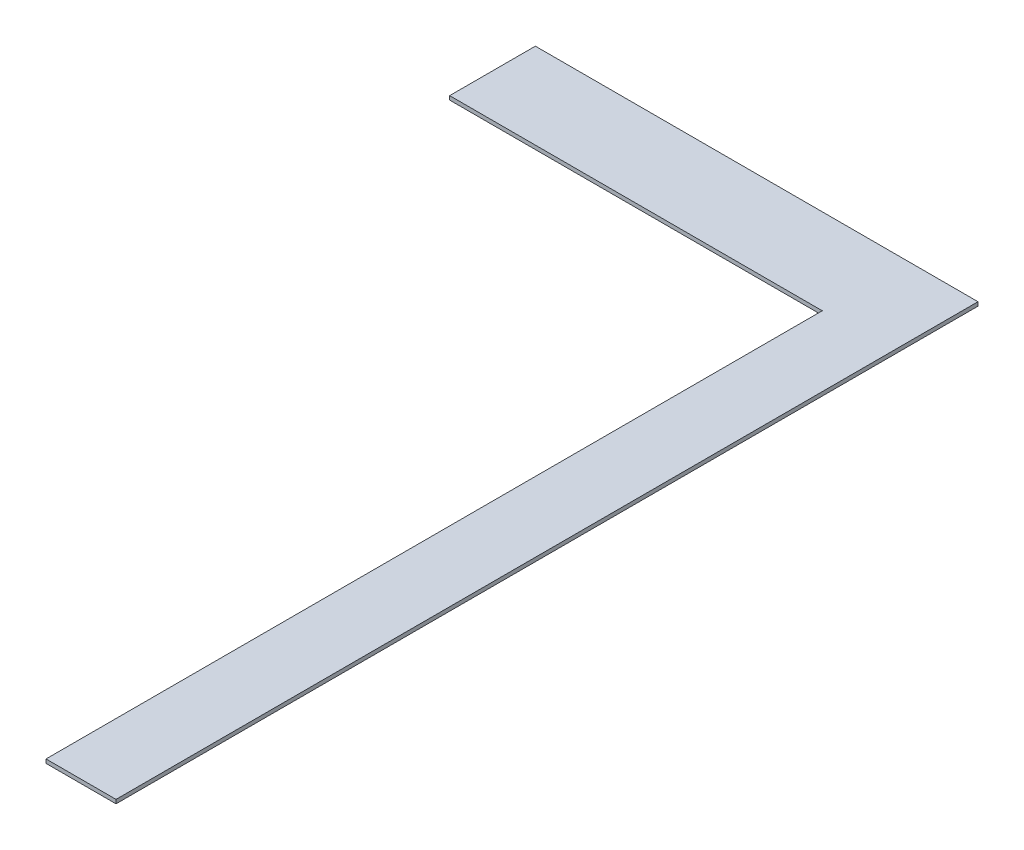
ISO-10303-21;
HEADER;
FILE_DESCRIPTION(('STEP AP214'),'2;1');
FILE_NAME('part.step','',(''),(''),'','','');
FILE_SCHEMA(('AUTOMOTIVE_DESIGN { 1 0 10303 214 1 1 1 1 }'));
ENDSEC;
DATA;
#1=APPLICATION_CONTEXT('core data for automotive mechanical design processes');
#2=APPLICATION_PROTOCOL_DEFINITION('international standard','automotive_design',2000,#1);
#3=PRODUCT_CONTEXT('',#1,'mechanical');
#4=PRODUCT('Part','Part','',(#3));
#5=PRODUCT_RELATED_PRODUCT_CATEGORY('part','',(#4));
#6=PRODUCT_DEFINITION_FORMATION('','',#4);
#7=PRODUCT_DEFINITION_CONTEXT('part definition',#1,'design');
#8=PRODUCT_DEFINITION('design','',#6,#7);
#9=PRODUCT_DEFINITION_SHAPE('','',#8);
#10=(LENGTH_UNIT() NAMED_UNIT(*) SI_UNIT(.MILLI.,.METRE.));
#11=(NAMED_UNIT(*) PLANE_ANGLE_UNIT() SI_UNIT($,.RADIAN.));
#12=(NAMED_UNIT(*) SI_UNIT($,.STERADIAN.) SOLID_ANGLE_UNIT());
#13=UNCERTAINTY_MEASURE_WITH_UNIT(LENGTH_MEASURE(1.E-05),#10,'distance_accuracy_value','');
#14=(GEOMETRIC_REPRESENTATION_CONTEXT(3) GLOBAL_UNCERTAINTY_ASSIGNED_CONTEXT((#13)) GLOBAL_UNIT_ASSIGNED_CONTEXT((#10,
#11,#12)) REPRESENTATION_CONTEXT('',''));
#15=CARTESIAN_POINT('',(0.,0.,0.));
#16=DIRECTION('',(0.,0.,1.));
#17=DIRECTION('',(1.,0.,0.));
#18=AXIS2_PLACEMENT_3D('',#15,#16,#17);
#19=CARTESIAN_POINT('',(-1425.5,-12.5,276.));
#20=DIRECTION('',(0.,0.,1.));
#21=DIRECTION('',(1.,0.,0.));
#22=AXIS2_PLACEMENT_3D('',#19,#20,#21);
#23=PLANE('',#22);
#24=DIRECTION('',(1.,0.,0.));
#25=VECTOR('',#24,1.);
#26=CARTESIAN_POINT('',(-1425.5,0.,276.));
#27=LINE('',#26,#25);
#28=CARTESIAN_POINT('',(-1425.5,0.,276.));
#29=VERTEX_POINT('',#28);
#30=CARTESIAN_POINT('',(-225.5,0.,276.));
#31=VERTEX_POINT('',#30);
#32=EDGE_CURVE('E119',#29,#31,#27,.T.);
#33=ORIENTED_EDGE('',*,*,#32,.F.);
#34=DIRECTION('',(0.,1.,0.));
#35=VECTOR('',#34,1.);
#36=CARTESIAN_POINT('',(-1425.5,-12.5,276.));
#37=LINE('',#36,#35);
#38=CARTESIAN_POINT('',(-1425.5,-12.5,276.));
#39=VERTEX_POINT('',#38);
#40=EDGE_CURVE('E11',#39,#29,#37,.T.);
#41=ORIENTED_EDGE('',*,*,#40,.F.);
#42=DIRECTION('',(1.,0.,0.));
#43=VECTOR('',#42,1.);
#44=CARTESIAN_POINT('',(-1425.5,-12.5,276.));
#45=LINE('',#44,#43);
#46=CARTESIAN_POINT('',(-225.5,-12.5,276.));
#47=VERTEX_POINT('',#46);
#48=EDGE_CURVE('E133',#39,#47,#45,.T.);
#49=ORIENTED_EDGE('',*,*,#48,.T.);
#50=DIRECTION('',(0.,1.,0.));
#51=VECTOR('',#50,1.);
#52=CARTESIAN_POINT('',(-225.5,-12.5,276.));
#53=LINE('',#52,#51);
#54=EDGE_CURVE('E37',#47,#31,#53,.T.);
#55=ORIENTED_EDGE('',*,*,#54,.T.);
#56=EDGE_LOOP('',(#33,#41,#49,#55));
#57=FACE_BOUND('',#56,.T.);
#58=ADVANCED_FACE('F34',(#57),#23,.T.);
#59=CARTESIAN_POINT('',(-1425.5,-12.5,276.));
#60=DIRECTION('',(-1.,0.,0.));
#61=DIRECTION('',(0.,0.,1.));
#62=AXIS2_PLACEMENT_3D('',#59,#60,#61);
#63=PLANE('',#62);
#64=DIRECTION('',(0.,0.,1.));
#65=VECTOR('',#64,1.);
#66=CARTESIAN_POINT('',(-1425.5,0.,276.));
#67=LINE('',#66,#65);
#68=CARTESIAN_POINT('',(-1425.5,0.,0.));
#69=VERTEX_POINT('',#68);
#70=EDGE_CURVE('E131',#69,#29,#67,.T.);
#71=ORIENTED_EDGE('',*,*,#70,.F.);
#72=DIRECTION('',(0.,1.,0.));
#73=VECTOR('',#72,1.);
#74=CARTESIAN_POINT('',(-1425.5,-12.5,0.));
#75=LINE('',#74,#73);
#76=CARTESIAN_POINT('',(-1425.5,-12.5,0.));
#77=VERTEX_POINT('',#76);
#78=EDGE_CURVE('E43',#77,#69,#75,.T.);
#79=ORIENTED_EDGE('',*,*,#78,.F.);
#80=DIRECTION('',(0.,0.,1.));
#81=VECTOR('',#80,1.);
#82=CARTESIAN_POINT('',(-1425.5,-12.5,276.));
#83=LINE('',#82,#81);
#84=EDGE_CURVE('E109',#77,#39,#83,.T.);
#85=ORIENTED_EDGE('',*,*,#84,.T.);
#86=ORIENTED_EDGE('',*,*,#40,.T.);
#87=EDGE_LOOP('',(#71,#79,#85,#86));
#88=FACE_BOUND('',#87,.T.);
#89=ADVANCED_FACE('F141',(#88),#63,.T.);
#90=CARTESIAN_POINT('',(-1425.5,-12.5,0.));
#91=DIRECTION('',(0.,0.,-1.));
#92=DIRECTION('',(-1.,0.,0.));
#93=AXIS2_PLACEMENT_3D('',#90,#91,#92);
#94=PLANE('',#93);
#95=DIRECTION('',(-1.,0.,0.));
#96=VECTOR('',#95,1.);
#97=CARTESIAN_POINT('',(-1425.5,0.,0.));
#98=LINE('',#97,#96);
#99=CARTESIAN_POINT('',(0.,0.,0.));
#100=VERTEX_POINT('',#99);
#101=EDGE_CURVE('E96',#100,#69,#98,.T.);
#102=ORIENTED_EDGE('',*,*,#101,.F.);
#103=DIRECTION('',(0.,1.,0.));
#104=VECTOR('',#103,1.);
#105=CARTESIAN_POINT('',(0.,-12.5,0.));
#106=LINE('',#105,#104);
#107=CARTESIAN_POINT('',(0.,-12.5,0.));
#108=VERTEX_POINT('',#107);
#109=EDGE_CURVE('E91',#108,#100,#106,.T.);
#110=ORIENTED_EDGE('',*,*,#109,.F.);
#111=DIRECTION('',(-1.,0.,0.));
#112=VECTOR('',#111,1.);
#113=CARTESIAN_POINT('',(-1425.5,-12.5,0.));
#114=LINE('',#113,#112);
#115=EDGE_CURVE('E94',#108,#77,#114,.T.);
#116=ORIENTED_EDGE('',*,*,#115,.T.);
#117=ORIENTED_EDGE('',*,*,#78,.T.);
#118=EDGE_LOOP('',(#102,#110,#116,#117));
#119=FACE_BOUND('',#118,.T.);
#120=ADVANCED_FACE('F93',(#119),#94,.T.);
#121=CARTESIAN_POINT('',(0.,-12.5,0.));
#122=DIRECTION('',(1.,0.,0.));
#123=DIRECTION('',(0.,0.,-1.));
#124=AXIS2_PLACEMENT_3D('',#121,#122,#123);
#125=PLANE('',#124);
#126=DIRECTION('',(0.,0.,-1.));
#127=VECTOR('',#126,1.);
#128=CARTESIAN_POINT('',(0.,0.,0.));
#129=LINE('',#128,#127);
#130=CARTESIAN_POINT('',(3.40005801291454E-13,0.,2776.));
#131=VERTEX_POINT('',#130);
#132=EDGE_CURVE('E128',#131,#100,#129,.T.);
#133=ORIENTED_EDGE('',*,*,#132,.F.);
#134=DIRECTION('',(0.,1.,0.));
#135=VECTOR('',#134,1.);
#136=CARTESIAN_POINT('',(3.40005801291454E-13,-12.5,2776.));
#137=LINE('',#136,#135);
#138=CARTESIAN_POINT('',(3.40005801291454E-13,-12.5,2776.));
#139=VERTEX_POINT('',#138);
#140=EDGE_CURVE('E101',#139,#131,#137,.T.);
#141=ORIENTED_EDGE('',*,*,#140,.F.);
#142=DIRECTION('',(0.,0.,-1.));
#143=VECTOR('',#142,1.);
#144=CARTESIAN_POINT('',(0.,-12.5,0.));
#145=LINE('',#144,#143);
#146=EDGE_CURVE('E107',#139,#108,#145,.T.);
#147=ORIENTED_EDGE('',*,*,#146,.T.);
#148=ORIENTED_EDGE('',*,*,#109,.T.);
#149=EDGE_LOOP('',(#133,#141,#147,#148));
#150=FACE_BOUND('',#149,.T.);
#151=ADVANCED_FACE('F111',(#150),#125,.T.);
#152=CARTESIAN_POINT('',(3.40005801291454E-13,-12.5,2776.));
#153=DIRECTION('',(0.,0.,1.));
#154=DIRECTION('',(1.,0.,0.));
#155=AXIS2_PLACEMENT_3D('',#152,#153,#154);
#156=PLANE('',#155);
#157=DIRECTION('',(1.,0.,0.));
#158=VECTOR('',#157,1.);
#159=CARTESIAN_POINT('',(3.40005801291454E-13,0.,2776.));
#160=LINE('',#159,#158);
#161=CARTESIAN_POINT('',(-225.5,0.,2776.));
#162=VERTEX_POINT('',#161);
#163=EDGE_CURVE('E125',#162,#131,#160,.T.);
#164=ORIENTED_EDGE('',*,*,#163,.F.);
#165=DIRECTION('',(0.,1.,0.));
#166=VECTOR('',#165,1.);
#167=CARTESIAN_POINT('',(-225.5,-12.5,2776.));
#168=LINE('',#167,#166);
#169=CARTESIAN_POINT('',(-225.5,-12.5,2776.));
#170=VERTEX_POINT('',#169);
#171=EDGE_CURVE('E136',#170,#162,#168,.T.);
#172=ORIENTED_EDGE('',*,*,#171,.F.);
#173=DIRECTION('',(1.,0.,0.));
#174=VECTOR('',#173,1.);
#175=CARTESIAN_POINT('',(3.40005801291454E-13,-12.5,2776.));
#176=LINE('',#175,#174);
#177=EDGE_CURVE('E112',#170,#139,#176,.T.);
#178=ORIENTED_EDGE('',*,*,#177,.T.);
#179=ORIENTED_EDGE('',*,*,#140,.T.);
#180=EDGE_LOOP('',(#164,#172,#178,#179));
#181=FACE_BOUND('',#180,.T.);
#182=ADVANCED_FACE('F154',(#181),#156,.T.);
#183=CARTESIAN_POINT('',(-225.5,-12.5,276.));
#184=DIRECTION('',(-1.,0.,0.));
#185=DIRECTION('',(0.,0.,1.));
#186=AXIS2_PLACEMENT_3D('',#183,#184,#185);
#187=PLANE('',#186);
#188=DIRECTION('',(0.,0.,1.));
#189=VECTOR('',#188,1.);
#190=CARTESIAN_POINT('',(-225.5,0.,276.));
#191=LINE('',#190,#189);
#192=EDGE_CURVE('E122',#31,#162,#191,.T.);
#193=ORIENTED_EDGE('',*,*,#192,.F.);
#194=ORIENTED_EDGE('',*,*,#54,.F.);
#195=DIRECTION('',(0.,0.,1.));
#196=VECTOR('',#195,1.);
#197=CARTESIAN_POINT('',(-225.5,-12.5,276.));
#198=LINE('',#197,#196);
#199=EDGE_CURVE('E114',#47,#170,#198,.T.);
#200=ORIENTED_EDGE('',*,*,#199,.T.);
#201=ORIENTED_EDGE('',*,*,#171,.T.);
#202=EDGE_LOOP('',(#193,#194,#200,#201));
#203=FACE_BOUND('',#202,.T.);
#204=ADVANCED_FACE('F138',(#203),#187,.T.);
#205=CARTESIAN_POINT('',(0.,-12.5,0.));
#206=DIRECTION('',(0.,-1.,0.));
#207=DIRECTION('',(0.,0.,-1.));
#208=AXIS2_PLACEMENT_3D('',#205,#206,#207);
#209=PLANE('',#208);
#210=ORIENTED_EDGE('',*,*,#48,.F.);
#211=ORIENTED_EDGE('',*,*,#84,.F.);
#212=ORIENTED_EDGE('',*,*,#115,.F.);
#213=ORIENTED_EDGE('',*,*,#146,.F.);
#214=ORIENTED_EDGE('',*,*,#177,.F.);
#215=ORIENTED_EDGE('',*,*,#199,.F.);
#216=EDGE_LOOP('',(#210,#211,#212,#213,#214,#215));
#217=FACE_BOUND('',#216,.T.);
#218=ADVANCED_FACE('F105',(#217),#209,.T.);
#219=CARTESIAN_POINT('',(0.,0.,0.));
#220=DIRECTION('',(0.,-1.,0.));
#221=DIRECTION('',(0.,0.,-1.));
#222=AXIS2_PLACEMENT_3D('',#219,#220,#221);
#223=PLANE('',#222);
#224=ORIENTED_EDGE('',*,*,#32,.T.);
#225=ORIENTED_EDGE('',*,*,#192,.T.);
#226=ORIENTED_EDGE('',*,*,#163,.T.);
#227=ORIENTED_EDGE('',*,*,#132,.T.);
#228=ORIENTED_EDGE('',*,*,#101,.T.);
#229=ORIENTED_EDGE('',*,*,#70,.T.);
#230=EDGE_LOOP('',(#224,#225,#226,#227,#228,#229));
#231=FACE_BOUND('',#230,.T.);
#232=ADVANCED_FACE('F140',(#231),#223,.F.);
#233=CLOSED_SHELL('',(#58,#89,#120,#151,#182,#204,#218,#232));
#234=MANIFOLD_SOLID_BREP('B2',#233);
#235=ADVANCED_BREP_SHAPE_REPRESENTATION('',(#18,#234),#14);
#236=SHAPE_DEFINITION_REPRESENTATION(#9,#235);
ENDSEC;
END-ISO-10303-21;
